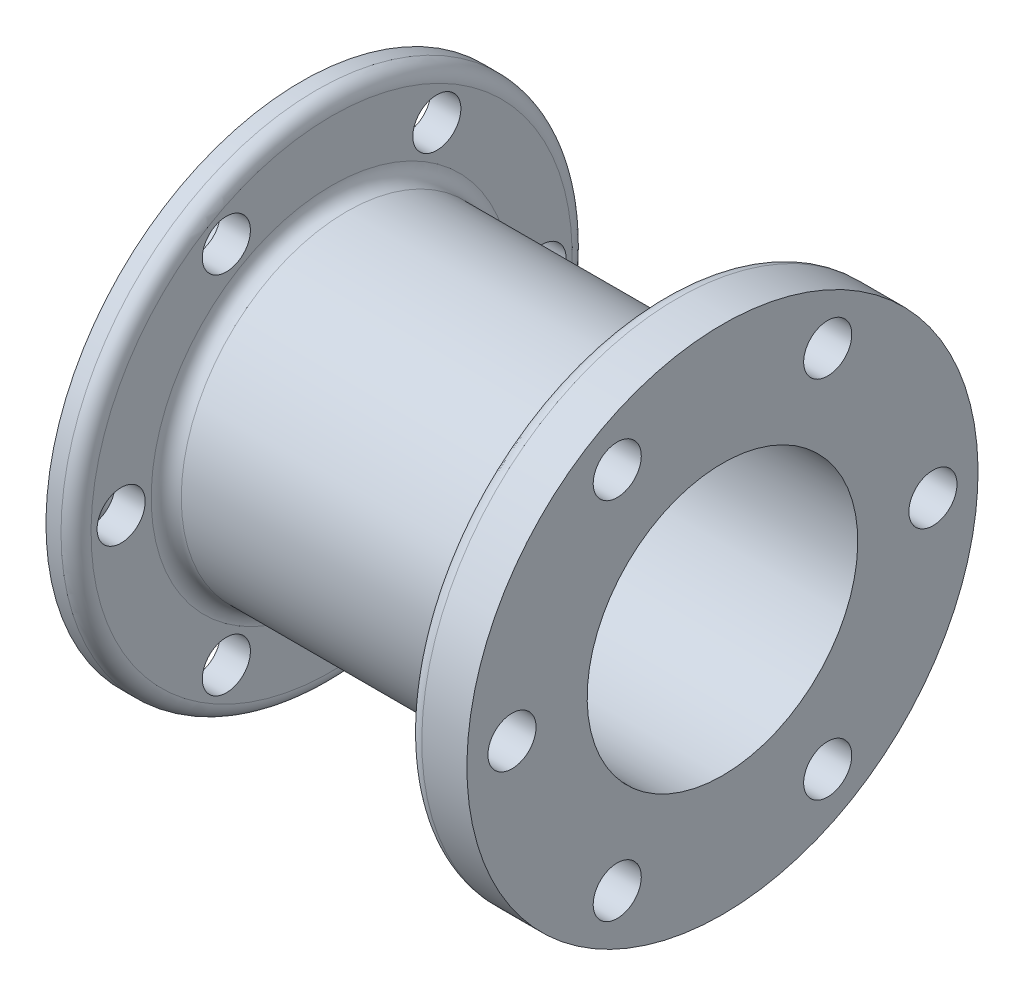
ISO-10303-21;
HEADER;
FILE_DESCRIPTION(('STEP AP214'),'2;1');
FILE_NAME('part.step','',(''),(''),'','','');
FILE_SCHEMA(('AUTOMOTIVE_DESIGN { 1 0 10303 214 1 1 1 1 }'));
ENDSEC;
DATA;
#1=APPLICATION_CONTEXT('core data for automotive mechanical design processes');
#2=APPLICATION_PROTOCOL_DEFINITION('international standard','automotive_design',2000,#1);
#3=PRODUCT_CONTEXT('',#1,'mechanical');
#4=PRODUCT('Part','Part','',(#3));
#5=PRODUCT_RELATED_PRODUCT_CATEGORY('part','',(#4));
#6=PRODUCT_DEFINITION_FORMATION('','',#4);
#7=PRODUCT_DEFINITION_CONTEXT('part definition',#1,'design');
#8=PRODUCT_DEFINITION('design','',#6,#7);
#9=PRODUCT_DEFINITION_SHAPE('','',#8);
#10=(LENGTH_UNIT() NAMED_UNIT(*) SI_UNIT(.MILLI.,.METRE.));
#11=(NAMED_UNIT(*) PLANE_ANGLE_UNIT() SI_UNIT($,.RADIAN.));
#12=(NAMED_UNIT(*) SI_UNIT($,.STERADIAN.) SOLID_ANGLE_UNIT());
#13=UNCERTAINTY_MEASURE_WITH_UNIT(LENGTH_MEASURE(1.E-05),#10,'distance_accuracy_value','');
#14=(GEOMETRIC_REPRESENTATION_CONTEXT(3) GLOBAL_UNCERTAINTY_ASSIGNED_CONTEXT((#13)) GLOBAL_UNIT_ASSIGNED_CONTEXT((#10,
#11,#12)) REPRESENTATION_CONTEXT('',''));
#15=CARTESIAN_POINT('',(0.,0.,0.));
#16=DIRECTION('',(0.,0.,1.));
#17=DIRECTION('',(1.,0.,0.));
#18=AXIS2_PLACEMENT_3D('',#15,#16,#17);
#19=CARTESIAN_POINT('',(-80.,0.,0.));
#20=DIRECTION('',(-1.,0.,0.));
#21=DIRECTION('',(0.,-1.,0.));
#22=AXIS2_PLACEMENT_3D('',#19,#20,#21);
#23=CYLINDRICAL_SURFACE('',#22,39.);
#24=CARTESIAN_POINT('',(-75.,0.,0.));
#25=DIRECTION('',(-1.,0.,0.));
#26=DIRECTION('',(0.,-1.,0.));
#27=AXIS2_PLACEMENT_3D('',#24,#25,#26);
#28=CIRCLE('',#27,39.);
#29=CARTESIAN_POINT('',(-75.,-39.,0.));
#30=VERTEX_POINT('',#29);
#31=EDGE_CURVE('E118',#30,#30,#28,.T.);
#32=ORIENTED_EDGE('',*,*,#31,.F.);
#33=EDGE_LOOP('',(#32));
#34=FACE_BOUND('',#33,.T.);
#35=CARTESIAN_POINT('',(-80.,0.,0.));
#36=DIRECTION('',(-1.,0.,0.));
#37=DIRECTION('',(0.,-1.,0.));
#38=AXIS2_PLACEMENT_3D('',#35,#36,#37);
#39=CIRCLE('',#38,39.);
#40=CARTESIAN_POINT('',(-80.,-39.,0.));
#41=VERTEX_POINT('',#40);
#42=EDGE_CURVE('E97',#41,#41,#39,.T.);
#43=ORIENTED_EDGE('',*,*,#42,.T.);
#44=EDGE_LOOP('',(#43));
#45=FACE_BOUND('',#44,.T.);
#46=ADVANCED_FACE('F36',(#34,#45),#23,.F.);
#47=CARTESIAN_POINT('',(-75.,1.73472347597681E-13,0.));
#48=DIRECTION('',(-1.,0.,0.));
#49=DIRECTION('',(0.,-1.,0.));
#50=AXIS2_PLACEMENT_3D('',#47,#48,#49);
#51=PLANE('',#50);
#52=CARTESIAN_POINT('',(-75.,0.,0.));
#53=DIRECTION('',(-1.,0.,0.));
#54=DIRECTION('',(0.,-1.,0.));
#55=AXIS2_PLACEMENT_3D('',#52,#53,#54);
#56=CIRCLE('',#55,45.);
#57=CARTESIAN_POINT('',(-75.,-45.,0.));
#58=VERTEX_POINT('',#57);
#59=EDGE_CURVE('E115',#58,#58,#56,.T.);
#60=ORIENTED_EDGE('',*,*,#59,.F.);
#61=EDGE_LOOP('',(#60));
#62=FACE_BOUND('',#61,.T.);
#63=ORIENTED_EDGE('',*,*,#31,.T.);
#64=EDGE_LOOP('',(#63));
#65=FACE_BOUND('',#64,.T.);
#66=ADVANCED_FACE('F180',(#62,#65),#51,.F.);
#67=CARTESIAN_POINT('',(-80.,0.,0.));
#68=DIRECTION('',(-1.,0.,0.));
#69=DIRECTION('',(0.,-1.,0.));
#70=AXIS2_PLACEMENT_3D('',#67,#68,#69);
#71=CYLINDRICAL_SURFACE('',#70,45.);
#72=CARTESIAN_POINT('',(80.,0.,0.));
#73=DIRECTION('',(-1.,0.,0.));
#74=DIRECTION('',(0.,-1.,0.));
#75=AXIS2_PLACEMENT_3D('',#72,#73,#74);
#76=CIRCLE('',#75,45.);
#77=CARTESIAN_POINT('',(80.,-45.,0.));
#78=VERTEX_POINT('',#77);
#79=EDGE_CURVE('E112',#78,#78,#76,.T.);
#80=ORIENTED_EDGE('',*,*,#79,.F.);
#81=EDGE_LOOP('',(#80));
#82=FACE_BOUND('',#81,.T.);
#83=ORIENTED_EDGE('',*,*,#59,.T.);
#84=EDGE_LOOP('',(#83));
#85=FACE_BOUND('',#84,.T.);
#86=ADVANCED_FACE('F186',(#82,#85),#71,.F.);
#87=CARTESIAN_POINT('',(80.,0.,0.));
#88=DIRECTION('',(-1.,0.,0.));
#89=DIRECTION('',(0.,-1.,0.));
#90=AXIS2_PLACEMENT_3D('',#87,#88,#89);
#91=PLANE('',#90);
#92=CARTESIAN_POINT('',(80.,0.,-70.));
#93=DIRECTION('',(1.,0.,0.));
#94=DIRECTION('',(0.,1.,0.));
#95=AXIS2_PLACEMENT_3D('',#92,#93,#94);
#96=CIRCLE('',#95,8.);
#97=CARTESIAN_POINT('',(80.,8.00000000000001,-70.));
#98=VERTEX_POINT('',#97);
#99=EDGE_CURVE('E57',#98,#98,#96,.T.);
#100=ORIENTED_EDGE('',*,*,#99,.F.);
#101=EDGE_LOOP('',(#100));
#102=FACE_BOUND('',#101,.T.);
#103=CARTESIAN_POINT('',(80.,60.6217782649108,-35.));
#104=DIRECTION('',(1.,0.,0.));
#105=DIRECTION('',(0.,1.,0.));
#106=AXIS2_PLACEMENT_3D('',#103,#104,#105);
#107=CIRCLE('',#106,7.99999999999998);
#108=CARTESIAN_POINT('',(80.,68.6217782649107,-35.));
#109=VERTEX_POINT('',#108);
#110=EDGE_CURVE('E462',#109,#109,#107,.T.);
#111=ORIENTED_EDGE('',*,*,#110,.F.);
#112=EDGE_LOOP('',(#111));
#113=FACE_BOUND('',#112,.T.);
#114=CARTESIAN_POINT('',(80.,60.6217782649107,35.));
#115=DIRECTION('',(1.,0.,0.));
#116=DIRECTION('',(0.,1.,0.));
#117=AXIS2_PLACEMENT_3D('',#114,#115,#116);
#118=CIRCLE('',#117,7.99999999999999);
#119=CARTESIAN_POINT('',(80.,68.6217782649107,35.));
#120=VERTEX_POINT('',#119);
#121=EDGE_CURVE('E464',#120,#120,#118,.T.);
#122=ORIENTED_EDGE('',*,*,#121,.F.);
#123=EDGE_LOOP('',(#122));
#124=FACE_BOUND('',#123,.T.);
#125=CARTESIAN_POINT('',(80.,0.,70.));
#126=DIRECTION('',(1.,0.,0.));
#127=DIRECTION('',(0.,1.,0.));
#128=AXIS2_PLACEMENT_3D('',#125,#126,#127);
#129=CIRCLE('',#128,7.99999999999999);
#130=CARTESIAN_POINT('',(80.,7.99999999999999,70.));
#131=VERTEX_POINT('',#130);
#132=EDGE_CURVE('E468',#131,#131,#129,.T.);
#133=ORIENTED_EDGE('',*,*,#132,.F.);
#134=EDGE_LOOP('',(#133));
#135=FACE_BOUND('',#134,.T.);
#136=CARTESIAN_POINT('',(80.0000000000001,-60.6217782649107,35.));
#137=DIRECTION('',(1.,0.,0.));
#138=DIRECTION('',(0.,1.,0.));
#139=AXIS2_PLACEMENT_3D('',#136,#137,#138);
#140=CIRCLE('',#139,8.);
#141=CARTESIAN_POINT('',(80.0000000000001,-52.6217782649107,35.));
#142=VERTEX_POINT('',#141);
#143=EDGE_CURVE('E459',#142,#142,#140,.T.);
#144=ORIENTED_EDGE('',*,*,#143,.F.);
#145=EDGE_LOOP('',(#144));
#146=FACE_BOUND('',#145,.T.);
#147=CARTESIAN_POINT('',(80.0000000000001,-60.6217782649107,-35.));
#148=DIRECTION('',(1.,0.,0.));
#149=DIRECTION('',(0.,1.,0.));
#150=AXIS2_PLACEMENT_3D('',#147,#148,#149);
#151=CIRCLE('',#150,8.00000000000001);
#152=CARTESIAN_POINT('',(80.0000000000001,-52.6217782649107,-35.));
#153=VERTEX_POINT('',#152);
#154=EDGE_CURVE('E456',#153,#153,#151,.T.);
#155=ORIENTED_EDGE('',*,*,#154,.F.);
#156=EDGE_LOOP('',(#155));
#157=FACE_BOUND('',#156,.T.);
#158=CARTESIAN_POINT('',(80.,0.,0.));
#159=DIRECTION('',(-1.,0.,0.));
#160=DIRECTION('',(0.,-1.,0.));
#161=AXIS2_PLACEMENT_3D('',#158,#159,#160);
#162=CIRCLE('',#161,85.);
#163=CARTESIAN_POINT('',(80.,-85.,0.));
#164=VERTEX_POINT('',#163);
#165=EDGE_CURVE('E109',#164,#164,#162,.T.);
#166=ORIENTED_EDGE('',*,*,#165,.F.);
#167=EDGE_LOOP('',(#166));
#168=FACE_BOUND('',#167,.T.);
#169=ORIENTED_EDGE('',*,*,#79,.T.);
#170=EDGE_LOOP('',(#169));
#171=FACE_BOUND('',#170,.T.);
#172=ADVANCED_FACE('F215',(#102,#113,#124,#135,#146,#157,#168,#171),#91,.F.);
#173=CARTESIAN_POINT('',(-80.,0.,0.));
#174=DIRECTION('',(-1.,0.,0.));
#175=DIRECTION('',(0.,-1.,0.));
#176=AXIS2_PLACEMENT_3D('',#173,#174,#175);
#177=CYLINDRICAL_SURFACE('',#176,85.);
#178=CARTESIAN_POINT('',(65.,0.,0.));
#179=DIRECTION('',(-1.,0.,0.));
#180=DIRECTION('',(0.,-1.,0.));
#181=AXIS2_PLACEMENT_3D('',#178,#179,#180);
#182=CIRCLE('',#181,85.);
#183=CARTESIAN_POINT('',(65.,-85.,0.));
#184=VERTEX_POINT('',#183);
#185=EDGE_CURVE('E127',#184,#184,#182,.F.);
#186=ORIENTED_EDGE('',*,*,#185,.T.);
#187=EDGE_LOOP('',(#186));
#188=FACE_BOUND('',#187,.T.);
#189=ORIENTED_EDGE('',*,*,#165,.T.);
#190=EDGE_LOOP('',(#189));
#191=FACE_BOUND('',#190,.T.);
#192=ADVANCED_FACE('F205',(#188,#191),#177,.T.);
#193=CARTESIAN_POINT('',(60.,0.,0.));
#194=DIRECTION('',(-1.,0.,0.));
#195=DIRECTION('',(0.,-1.,0.));
#196=AXIS2_PLACEMENT_3D('',#193,#194,#195);
#197=PLANE('',#196);
#198=CARTESIAN_POINT('',(60.,0.,-70.));
#199=DIRECTION('',(-1.,0.,0.));
#200=DIRECTION('',(0.,-1.,0.));
#201=AXIS2_PLACEMENT_3D('',#198,#199,#200);
#202=CIRCLE('',#201,8.);
#203=CARTESIAN_POINT('',(60.,-7.99999999999999,-70.));
#204=VERTEX_POINT('',#203);
#205=EDGE_CURVE('E94',#204,#204,#202,.T.);
#206=ORIENTED_EDGE('',*,*,#205,.F.);
#207=EDGE_LOOP('',(#206));
#208=FACE_BOUND('',#207,.T.);
#209=CARTESIAN_POINT('',(60.,60.6217782649108,-35.));
#210=DIRECTION('',(-1.,0.,0.));
#211=DIRECTION('',(0.,-1.,0.));
#212=AXIS2_PLACEMENT_3D('',#209,#210,#211);
#213=CIRCLE('',#212,7.99999999999998);
#214=CARTESIAN_POINT('',(60.,52.6217782649108,-35.));
#215=VERTEX_POINT('',#214);
#216=EDGE_CURVE('E79',#215,#215,#213,.T.);
#217=ORIENTED_EDGE('',*,*,#216,.F.);
#218=EDGE_LOOP('',(#217));
#219=FACE_BOUND('',#218,.T.);
#220=CARTESIAN_POINT('',(60.,60.6217782649107,35.));
#221=DIRECTION('',(-1.,0.,0.));
#222=DIRECTION('',(0.,-1.,0.));
#223=AXIS2_PLACEMENT_3D('',#220,#221,#222);
#224=CIRCLE('',#223,7.99999999999999);
#225=CARTESIAN_POINT('',(60.,52.6217782649107,35.));
#226=VERTEX_POINT('',#225);
#227=EDGE_CURVE('E75',#226,#226,#224,.T.);
#228=ORIENTED_EDGE('',*,*,#227,.F.);
#229=EDGE_LOOP('',(#228));
#230=FACE_BOUND('',#229,.T.);
#231=CARTESIAN_POINT('',(60.,0.,70.));
#232=DIRECTION('',(-1.,0.,0.));
#233=DIRECTION('',(0.,-1.,0.));
#234=AXIS2_PLACEMENT_3D('',#231,#232,#233);
#235=CIRCLE('',#234,7.99999999999999);
#236=CARTESIAN_POINT('',(60.,-7.99999999999999,70.));
#237=VERTEX_POINT('',#236);
#238=EDGE_CURVE('E71',#237,#237,#235,.T.);
#239=ORIENTED_EDGE('',*,*,#238,.F.);
#240=EDGE_LOOP('',(#239));
#241=FACE_BOUND('',#240,.T.);
#242=CARTESIAN_POINT('',(60.,-60.6217782649107,35.));
#243=DIRECTION('',(-1.,0.,0.));
#244=DIRECTION('',(0.,-1.,0.));
#245=AXIS2_PLACEMENT_3D('',#242,#243,#244);
#246=CIRCLE('',#245,8.);
#247=CARTESIAN_POINT('',(60.,-68.6217782649107,35.));
#248=VERTEX_POINT('',#247);
#249=EDGE_CURVE('E67',#248,#248,#246,.T.);
#250=ORIENTED_EDGE('',*,*,#249,.F.);
#251=EDGE_LOOP('',(#250));
#252=FACE_BOUND('',#251,.T.);
#253=CARTESIAN_POINT('',(60.,-60.6217782649107,-35.));
#254=DIRECTION('',(-1.,0.,0.));
#255=DIRECTION('',(0.,-1.,0.));
#256=AXIS2_PLACEMENT_3D('',#253,#254,#255);
#257=CIRCLE('',#256,8.00000000000001);
#258=CARTESIAN_POINT('',(60.,-68.6217782649107,-35.));
#259=VERTEX_POINT('',#258);
#260=EDGE_CURVE('E62',#259,#259,#257,.T.);
#261=ORIENTED_EDGE('',*,*,#260,.F.);
#262=EDGE_LOOP('',(#261));
#263=FACE_BOUND('',#262,.T.);
#264=CARTESIAN_POINT('',(60.,0.,0.));
#265=DIRECTION('',(-1.,0.,0.));
#266=DIRECTION('',(0.,-1.,0.));
#267=AXIS2_PLACEMENT_3D('',#264,#265,#266);
#268=CIRCLE('',#267,80.);
#269=CARTESIAN_POINT('',(60.,-79.9999999999999,0.));
#270=VERTEX_POINT('',#269);
#271=EDGE_CURVE('E124',#270,#270,#268,.T.);
#272=ORIENTED_EDGE('',*,*,#271,.T.);
#273=EDGE_LOOP('',(#272));
#274=FACE_BOUND('',#273,.T.);
#275=CARTESIAN_POINT('',(60.,0.,0.));
#276=DIRECTION('',(-1.,0.,0.));
#277=DIRECTION('',(0.,-1.,0.));
#278=AXIS2_PLACEMENT_3D('',#275,#276,#277);
#279=CIRCLE('',#278,60.);
#280=CARTESIAN_POINT('',(60.,-60.,0.));
#281=VERTEX_POINT('',#280);
#282=EDGE_CURVE('E121',#281,#281,#279,.F.);
#283=ORIENTED_EDGE('',*,*,#282,.T.);
#284=EDGE_LOOP('',(#283));
#285=FACE_BOUND('',#284,.T.);
#286=ADVANCED_FACE('F202',(#208,#219,#230,#241,#252,#263,#274,#285),#197,.T.);
#287=CARTESIAN_POINT('',(-80.,0.,0.));
#288=DIRECTION('',(-1.,0.,0.));
#289=DIRECTION('',(0.,-1.,0.));
#290=AXIS2_PLACEMENT_3D('',#287,#288,#289);
#291=CYLINDRICAL_SURFACE('',#290,55.);
#292=CARTESIAN_POINT('',(55.,0.,0.));
#293=DIRECTION('',(-1.,0.,0.));
#294=DIRECTION('',(0.,-1.,0.));
#295=AXIS2_PLACEMENT_3D('',#292,#293,#294);
#296=CIRCLE('',#295,55.);
#297=CARTESIAN_POINT('',(55.,-55.,0.));
#298=VERTEX_POINT('',#297);
#299=EDGE_CURVE('E10',#298,#298,#296,.T.);
#300=ORIENTED_EDGE('',*,*,#299,.T.);
#301=EDGE_LOOP('',(#300));
#302=FACE_BOUND('',#301,.T.);
#303=CARTESIAN_POINT('',(-45.,0.,0.));
#304=DIRECTION('',(1.,0.,0.));
#305=DIRECTION('',(0.,1.,0.));
#306=AXIS2_PLACEMENT_3D('',#303,#304,#305);
#307=CIRCLE('',#306,55.);
#308=CARTESIAN_POINT('',(-45.,55.,0.));
#309=VERTEX_POINT('',#308);
#310=EDGE_CURVE('E44',#309,#309,#307,.T.);
#311=ORIENTED_EDGE('',*,*,#310,.T.);
#312=EDGE_LOOP('',(#311));
#313=FACE_BOUND('',#312,.T.);
#314=ADVANCED_FACE('F204',(#302,#313),#291,.T.);
#315=CARTESIAN_POINT('',(-50.,0.,0.));
#316=DIRECTION('',(1.,0.,0.));
#317=DIRECTION('',(0.,1.,0.));
#318=AXIS2_PLACEMENT_3D('',#315,#316,#317);
#319=PLANE('',#318);
#320=CARTESIAN_POINT('',(-50.,0.,-70.));
#321=DIRECTION('',(1.,0.,0.));
#322=DIRECTION('',(0.,1.,0.));
#323=AXIS2_PLACEMENT_3D('',#320,#321,#322);
#324=CIRCLE('',#323,8.);
#325=CARTESIAN_POINT('',(-50.,7.99999999999999,-70.));
#326=VERTEX_POINT('',#325);
#327=EDGE_CURVE('E91',#326,#326,#324,.T.);
#328=ORIENTED_EDGE('',*,*,#327,.F.);
#329=EDGE_LOOP('',(#328));
#330=FACE_BOUND('',#329,.T.);
#331=CARTESIAN_POINT('',(-50.,60.6217782649107,-35.));
#332=DIRECTION('',(1.,0.,0.));
#333=DIRECTION('',(0.,1.,0.));
#334=AXIS2_PLACEMENT_3D('',#331,#332,#333);
#335=CIRCLE('',#334,7.99999999999998);
#336=CARTESIAN_POINT('',(-50.,68.6217782649107,-35.));
#337=VERTEX_POINT('',#336);
#338=EDGE_CURVE('E74',#337,#337,#335,.T.);
#339=ORIENTED_EDGE('',*,*,#338,.F.);
#340=EDGE_LOOP('',(#339));
#341=FACE_BOUND('',#340,.T.);
#342=CARTESIAN_POINT('',(-50.,60.6217782649107,35.));
#343=DIRECTION('',(1.,0.,0.));
#344=DIRECTION('',(0.,1.,0.));
#345=AXIS2_PLACEMENT_3D('',#342,#343,#344);
#346=CIRCLE('',#345,7.99999999999999);
#347=CARTESIAN_POINT('',(-50.,68.6217782649107,35.));
#348=VERTEX_POINT('',#347);
#349=EDGE_CURVE('E70',#348,#348,#346,.T.);
#350=ORIENTED_EDGE('',*,*,#349,.F.);
#351=EDGE_LOOP('',(#350));
#352=FACE_BOUND('',#351,.T.);
#353=CARTESIAN_POINT('',(-50.,0.,70.));
#354=DIRECTION('',(1.,0.,0.));
#355=DIRECTION('',(0.,1.,0.));
#356=AXIS2_PLACEMENT_3D('',#353,#354,#355);
#357=CIRCLE('',#356,7.99999999999999);
#358=CARTESIAN_POINT('',(-50.,7.99999999999997,70.));
#359=VERTEX_POINT('',#358);
#360=EDGE_CURVE('E66',#359,#359,#357,.T.);
#361=ORIENTED_EDGE('',*,*,#360,.F.);
#362=EDGE_LOOP('',(#361));
#363=FACE_BOUND('',#362,.T.);
#364=CARTESIAN_POINT('',(-50.,-60.6217782649107,35.));
#365=DIRECTION('',(1.,0.,0.));
#366=DIRECTION('',(0.,1.,0.));
#367=AXIS2_PLACEMENT_3D('',#364,#365,#366);
#368=CIRCLE('',#367,8.);
#369=CARTESIAN_POINT('',(-50.,-52.6217782649107,35.));
#370=VERTEX_POINT('',#369);
#371=EDGE_CURVE('E61',#370,#370,#368,.T.);
#372=ORIENTED_EDGE('',*,*,#371,.F.);
#373=EDGE_LOOP('',(#372));
#374=FACE_BOUND('',#373,.T.);
#375=CARTESIAN_POINT('',(-50.,-60.6217782649107,-35.));
#376=DIRECTION('',(1.,0.,0.));
#377=DIRECTION('',(0.,1.,0.));
#378=AXIS2_PLACEMENT_3D('',#375,#376,#377);
#379=CIRCLE('',#378,8.00000000000001);
#380=CARTESIAN_POINT('',(-50.,-52.6217782649107,-35.));
#381=VERTEX_POINT('',#380);
#382=EDGE_CURVE('E56',#381,#381,#379,.T.);
#383=ORIENTED_EDGE('',*,*,#382,.F.);
#384=EDGE_LOOP('',(#383));
#385=FACE_BOUND('',#384,.T.);
#386=CARTESIAN_POINT('',(-50.,0.,0.));
#387=DIRECTION('',(1.,0.,0.));
#388=DIRECTION('',(0.,1.,0.));
#389=AXIS2_PLACEMENT_3D('',#386,#387,#388);
#390=CIRCLE('',#389,80.);
#391=CARTESIAN_POINT('',(-50.,80.,0.));
#392=VERTEX_POINT('',#391);
#393=EDGE_CURVE('E49',#392,#392,#390,.T.);
#394=ORIENTED_EDGE('',*,*,#393,.T.);
#395=EDGE_LOOP('',(#394));
#396=FACE_BOUND('',#395,.T.);
#397=CARTESIAN_POINT('',(-50.,0.,0.));
#398=DIRECTION('',(1.,0.,0.));
#399=DIRECTION('',(0.,1.,0.));
#400=AXIS2_PLACEMENT_3D('',#397,#398,#399);
#401=CIRCLE('',#400,60.);
#402=CARTESIAN_POINT('',(-50.,60.,0.));
#403=VERTEX_POINT('',#402);
#404=EDGE_CURVE('E133',#403,#403,#401,.F.);
#405=ORIENTED_EDGE('',*,*,#404,.T.);
#406=EDGE_LOOP('',(#405));
#407=FACE_BOUND('',#406,.T.);
#408=ADVANCED_FACE('F138',(#330,#341,#352,#363,#374,#385,#396,#407),#319,.T.);
#409=CARTESIAN_POINT('',(-80.,0.,0.));
#410=DIRECTION('',(-1.,0.,0.));
#411=DIRECTION('',(0.,-1.,0.));
#412=AXIS2_PLACEMENT_3D('',#409,#410,#411);
#413=CYLINDRICAL_SURFACE('',#412,85.);
#414=CARTESIAN_POINT('',(-55.,0.,0.));
#415=DIRECTION('',(1.,0.,0.));
#416=DIRECTION('',(0.,1.,0.));
#417=AXIS2_PLACEMENT_3D('',#414,#415,#416);
#418=CIRCLE('',#417,85.);
#419=CARTESIAN_POINT('',(-55.,85.,0.));
#420=VERTEX_POINT('',#419);
#421=EDGE_CURVE('E130',#420,#420,#418,.F.);
#422=ORIENTED_EDGE('',*,*,#421,.T.);
#423=EDGE_LOOP('',(#422));
#424=FACE_BOUND('',#423,.T.);
#425=CARTESIAN_POINT('',(-60.,0.,0.));
#426=DIRECTION('',(-1.,0.,0.));
#427=DIRECTION('',(0.,-1.,0.));
#428=AXIS2_PLACEMENT_3D('',#425,#426,#427);
#429=CIRCLE('',#428,85.);
#430=CARTESIAN_POINT('',(-60.,-85.,0.));
#431=VERTEX_POINT('',#430);
#432=EDGE_CURVE('E106',#431,#431,#429,.T.);
#433=ORIENTED_EDGE('',*,*,#432,.F.);
#434=EDGE_LOOP('',(#433));
#435=FACE_BOUND('',#434,.T.);
#436=ADVANCED_FACE('F149',(#424,#435),#413,.T.);
#437=CARTESIAN_POINT('',(-60.,0.,0.));
#438=DIRECTION('',(-1.,0.,0.));
#439=DIRECTION('',(0.,-1.,0.));
#440=AXIS2_PLACEMENT_3D('',#437,#438,#439);
#441=PLANE('',#440);
#442=CARTESIAN_POINT('',(-60.,0.,-70.));
#443=DIRECTION('',(-1.,0.,0.));
#444=DIRECTION('',(0.,-1.,0.));
#445=AXIS2_PLACEMENT_3D('',#442,#443,#444);
#446=CIRCLE('',#445,8.);
#447=CARTESIAN_POINT('',(-60.,-8.00000000000001,-70.));
#448=VERTEX_POINT('',#447);
#449=EDGE_CURVE('E40',#448,#448,#446,.T.);
#450=ORIENTED_EDGE('',*,*,#449,.F.);
#451=EDGE_LOOP('',(#450));
#452=FACE_BOUND('',#451,.T.);
#453=CARTESIAN_POINT('',(-60.,60.6217782649107,-35.));
#454=DIRECTION('',(-1.,0.,0.));
#455=DIRECTION('',(0.,-1.,0.));
#456=AXIS2_PLACEMENT_3D('',#453,#454,#455);
#457=CIRCLE('',#456,7.99999999999998);
#458=CARTESIAN_POINT('',(-60.,52.6217782649108,-35.));
#459=VERTEX_POINT('',#458);
#460=EDGE_CURVE('E72',#459,#459,#457,.T.);
#461=ORIENTED_EDGE('',*,*,#460,.F.);
#462=EDGE_LOOP('',(#461));
#463=FACE_BOUND('',#462,.T.);
#464=CARTESIAN_POINT('',(-60.,60.6217782649107,35.));
#465=DIRECTION('',(-1.,0.,0.));
#466=DIRECTION('',(0.,-1.,0.));
#467=AXIS2_PLACEMENT_3D('',#464,#465,#466);
#468=CIRCLE('',#467,7.99999999999999);
#469=CARTESIAN_POINT('',(-60.,52.6217782649107,35.));
#470=VERTEX_POINT('',#469);
#471=EDGE_CURVE('E68',#470,#470,#468,.T.);
#472=ORIENTED_EDGE('',*,*,#471,.F.);
#473=EDGE_LOOP('',(#472));
#474=FACE_BOUND('',#473,.T.);
#475=CARTESIAN_POINT('',(-60.,0.,70.));
#476=DIRECTION('',(-1.,0.,0.));
#477=DIRECTION('',(0.,-1.,0.));
#478=AXIS2_PLACEMENT_3D('',#475,#476,#477);
#479=CIRCLE('',#478,7.99999999999999);
#480=CARTESIAN_POINT('',(-60.,-8.00000000000001,70.));
#481=VERTEX_POINT('',#480);
#482=EDGE_CURVE('E63',#481,#481,#479,.T.);
#483=ORIENTED_EDGE('',*,*,#482,.F.);
#484=EDGE_LOOP('',(#483));
#485=FACE_BOUND('',#484,.T.);
#486=CARTESIAN_POINT('',(-60.,-60.6217782649107,35.));
#487=DIRECTION('',(-1.,0.,0.));
#488=DIRECTION('',(0.,-1.,0.));
#489=AXIS2_PLACEMENT_3D('',#486,#487,#488);
#490=CIRCLE('',#489,8.);
#491=CARTESIAN_POINT('',(-60.,-68.6217782649107,35.));
#492=VERTEX_POINT('',#491);
#493=EDGE_CURVE('E58',#492,#492,#490,.T.);
#494=ORIENTED_EDGE('',*,*,#493,.F.);
#495=EDGE_LOOP('',(#494));
#496=FACE_BOUND('',#495,.T.);
#497=CARTESIAN_POINT('',(-60.,-60.6217782649107,-35.));
#498=DIRECTION('',(-1.,0.,0.));
#499=DIRECTION('',(0.,-1.,0.));
#500=AXIS2_PLACEMENT_3D('',#497,#498,#499);
#501=CIRCLE('',#500,8.00000000000001);
#502=CARTESIAN_POINT('',(-60.,-68.6217782649107,-35.));
#503=VERTEX_POINT('',#502);
#504=EDGE_CURVE('E53',#503,#503,#501,.T.);
#505=ORIENTED_EDGE('',*,*,#504,.F.);
#506=EDGE_LOOP('',(#505));
#507=FACE_BOUND('',#506,.T.);
#508=ORIENTED_EDGE('',*,*,#432,.T.);
#509=EDGE_LOOP('',(#508));
#510=FACE_BOUND('',#509,.T.);
#511=CARTESIAN_POINT('',(-60.,0.,0.));
#512=DIRECTION('',(-1.,0.,0.));
#513=DIRECTION('',(0.,-1.,0.));
#514=AXIS2_PLACEMENT_3D('',#511,#512,#513);
#515=CIRCLE('',#514,55.);
#516=CARTESIAN_POINT('',(-60.,-55.,0.));
#517=VERTEX_POINT('',#516);
#518=EDGE_CURVE('E103',#517,#517,#515,.T.);
#519=ORIENTED_EDGE('',*,*,#518,.F.);
#520=EDGE_LOOP('',(#519));
#521=FACE_BOUND('',#520,.T.);
#522=ADVANCED_FACE('F152',(#452,#463,#474,#485,#496,#507,#510,#521),#441,.T.);
#523=CARTESIAN_POINT('',(-80.,0.,0.));
#524=DIRECTION('',(-1.,0.,0.));
#525=DIRECTION('',(0.,-1.,0.));
#526=AXIS2_PLACEMENT_3D('',#523,#524,#525);
#527=CYLINDRICAL_SURFACE('',#526,55.);
#528=ORIENTED_EDGE('',*,*,#518,.T.);
#529=EDGE_LOOP('',(#528));
#530=FACE_BOUND('',#529,.T.);
#531=CARTESIAN_POINT('',(-80.,0.,0.));
#532=DIRECTION('',(-1.,0.,0.));
#533=DIRECTION('',(0.,-1.,0.));
#534=AXIS2_PLACEMENT_3D('',#531,#532,#533);
#535=CIRCLE('',#534,55.);
#536=CARTESIAN_POINT('',(-80.,-55.,0.));
#537=VERTEX_POINT('',#536);
#538=EDGE_CURVE('E100',#537,#537,#535,.T.);
#539=ORIENTED_EDGE('',*,*,#538,.F.);
#540=EDGE_LOOP('',(#539));
#541=FACE_BOUND('',#540,.T.);
#542=ADVANCED_FACE('F158',(#530,#541),#527,.T.);
#543=CARTESIAN_POINT('',(-80.,0.,0.));
#544=DIRECTION('',(1.,0.,0.));
#545=DIRECTION('',(0.,1.,0.));
#546=AXIS2_PLACEMENT_3D('',#543,#544,#545);
#547=PLANE('',#546);
#548=ORIENTED_EDGE('',*,*,#42,.F.);
#549=EDGE_LOOP('',(#548));
#550=FACE_BOUND('',#549,.T.);
#551=ORIENTED_EDGE('',*,*,#538,.T.);
#552=EDGE_LOOP('',(#551));
#553=FACE_BOUND('',#552,.T.);
#554=ADVANCED_FACE('F165',(#550,#553),#547,.F.);
#555=CARTESIAN_POINT('',(65.,0.,0.));
#556=DIRECTION('',(-1.,0.,0.));
#557=DIRECTION('',(0.,-1.,0.));
#558=AXIS2_PLACEMENT_3D('',#555,#556,#557);
#559=TOROIDAL_SURFACE('',#558,80.,5.);
#560=ORIENTED_EDGE('',*,*,#185,.F.);
#561=EDGE_LOOP('',(#560));
#562=FACE_BOUND('',#561,.T.);
#563=ORIENTED_EDGE('',*,*,#271,.F.);
#564=EDGE_LOOP('',(#563));
#565=FACE_BOUND('',#564,.T.);
#566=ADVANCED_FACE('F145',(#562,#565),#559,.T.);
#567=CARTESIAN_POINT('',(-55.,0.,0.));
#568=DIRECTION('',(1.,0.,0.));
#569=DIRECTION('',(0.,1.,0.));
#570=AXIS2_PLACEMENT_3D('',#567,#568,#569);
#571=TOROIDAL_SURFACE('',#570,80.,5.);
#572=ORIENTED_EDGE('',*,*,#393,.F.);
#573=EDGE_LOOP('',(#572));
#574=FACE_BOUND('',#573,.T.);
#575=ORIENTED_EDGE('',*,*,#421,.F.);
#576=EDGE_LOOP('',(#575));
#577=FACE_BOUND('',#576,.T.);
#578=ADVANCED_FACE('F141',(#574,#577),#571,.T.);
#579=CARTESIAN_POINT('',(55.,0.,0.));
#580=DIRECTION('',(-1.,0.,0.));
#581=DIRECTION('',(0.,-1.,0.));
#582=AXIS2_PLACEMENT_3D('',#579,#580,#581);
#583=TOROIDAL_SURFACE('',#582,60.,5.);
#584=ORIENTED_EDGE('',*,*,#282,.F.);
#585=EDGE_LOOP('',(#584));
#586=FACE_BOUND('',#585,.T.);
#587=ORIENTED_EDGE('',*,*,#299,.F.);
#588=EDGE_LOOP('',(#587));
#589=FACE_BOUND('',#588,.T.);
#590=ADVANCED_FACE('F144',(#586,#589),#583,.F.);
#591=CARTESIAN_POINT('',(-45.,0.,0.));
#592=DIRECTION('',(1.,0.,0.));
#593=DIRECTION('',(0.,1.,0.));
#594=AXIS2_PLACEMENT_3D('',#591,#592,#593);
#595=TOROIDAL_SURFACE('',#594,60.,5.);
#596=ORIENTED_EDGE('',*,*,#310,.F.);
#597=EDGE_LOOP('',(#596));
#598=FACE_BOUND('',#597,.T.);
#599=ORIENTED_EDGE('',*,*,#404,.F.);
#600=EDGE_LOOP('',(#599));
#601=FACE_BOUND('',#600,.T.);
#602=ADVANCED_FACE('F38',(#598,#601),#595,.F.);
#603=CARTESIAN_POINT('',(-80.,-60.6217782649107,-35.));
#604=DIRECTION('',(1.,0.,0.));
#605=DIRECTION('',(0.,1.,0.));
#606=AXIS2_PLACEMENT_3D('',#603,#604,#605);
#607=CYLINDRICAL_SURFACE('',#606,8.00000000000001);
#608=ORIENTED_EDGE('',*,*,#382,.T.);
#609=EDGE_LOOP('',(#608));
#610=FACE_BOUND('',#609,.T.);
#611=ORIENTED_EDGE('',*,*,#504,.T.);
#612=EDGE_LOOP('',(#611));
#613=FACE_BOUND('',#612,.T.);
#614=ADVANCED_FACE('F197',(#610,#613),#607,.F.);
#615=CARTESIAN_POINT('',(-80.,-60.6217782649107,35.));
#616=DIRECTION('',(1.,0.,0.));
#617=DIRECTION('',(0.,1.,0.));
#618=AXIS2_PLACEMENT_3D('',#615,#616,#617);
#619=CYLINDRICAL_SURFACE('',#618,8.);
#620=ORIENTED_EDGE('',*,*,#371,.T.);
#621=EDGE_LOOP('',(#620));
#622=FACE_BOUND('',#621,.T.);
#623=ORIENTED_EDGE('',*,*,#493,.T.);
#624=EDGE_LOOP('',(#623));
#625=FACE_BOUND('',#624,.T.);
#626=ADVANCED_FACE('F324',(#622,#625),#619,.F.);
#627=CARTESIAN_POINT('',(-80.,0.,70.));
#628=DIRECTION('',(1.,0.,0.));
#629=DIRECTION('',(0.,1.,0.));
#630=AXIS2_PLACEMENT_3D('',#627,#628,#629);
#631=CYLINDRICAL_SURFACE('',#630,7.99999999999999);
#632=ORIENTED_EDGE('',*,*,#360,.T.);
#633=EDGE_LOOP('',(#632));
#634=FACE_BOUND('',#633,.T.);
#635=ORIENTED_EDGE('',*,*,#482,.T.);
#636=EDGE_LOOP('',(#635));
#637=FACE_BOUND('',#636,.T.);
#638=ADVANCED_FACE('F336',(#634,#637),#631,.F.);
#639=CARTESIAN_POINT('',(-80.,60.6217782649107,35.));
#640=DIRECTION('',(1.,0.,0.));
#641=DIRECTION('',(0.,1.,0.));
#642=AXIS2_PLACEMENT_3D('',#639,#640,#641);
#643=CYLINDRICAL_SURFACE('',#642,7.99999999999999);
#644=ORIENTED_EDGE('',*,*,#349,.T.);
#645=EDGE_LOOP('',(#644));
#646=FACE_BOUND('',#645,.T.);
#647=ORIENTED_EDGE('',*,*,#471,.T.);
#648=EDGE_LOOP('',(#647));
#649=FACE_BOUND('',#648,.T.);
#650=ADVANCED_FACE('F348',(#646,#649),#643,.F.);
#651=CARTESIAN_POINT('',(-80.,60.6217782649107,-35.));
#652=DIRECTION('',(1.,0.,0.));
#653=DIRECTION('',(0.,1.,0.));
#654=AXIS2_PLACEMENT_3D('',#651,#652,#653);
#655=CYLINDRICAL_SURFACE('',#654,7.99999999999998);
#656=ORIENTED_EDGE('',*,*,#338,.T.);
#657=EDGE_LOOP('',(#656));
#658=FACE_BOUND('',#657,.T.);
#659=ORIENTED_EDGE('',*,*,#460,.T.);
#660=EDGE_LOOP('',(#659));
#661=FACE_BOUND('',#660,.T.);
#662=ADVANCED_FACE('F360',(#658,#661),#655,.F.);
#663=CARTESIAN_POINT('',(-80.,0.,-70.));
#664=DIRECTION('',(1.,0.,0.));
#665=DIRECTION('',(0.,1.,0.));
#666=AXIS2_PLACEMENT_3D('',#663,#664,#665);
#667=CYLINDRICAL_SURFACE('',#666,8.);
#668=ORIENTED_EDGE('',*,*,#327,.T.);
#669=EDGE_LOOP('',(#668));
#670=FACE_BOUND('',#669,.T.);
#671=ORIENTED_EDGE('',*,*,#449,.T.);
#672=EDGE_LOOP('',(#671));
#673=FACE_BOUND('',#672,.T.);
#674=ADVANCED_FACE('F371',(#670,#673),#667,.F.);
#675=ORIENTED_EDGE('',*,*,#260,.T.);
#676=EDGE_LOOP('',(#675));
#677=FACE_BOUND('',#676,.T.);
#678=ORIENTED_EDGE('',*,*,#154,.T.);
#679=EDGE_LOOP('',(#678));
#680=FACE_BOUND('',#679,.T.);
#681=ADVANCED_FACE('F327',(#677,#680),#607,.F.);
#682=ORIENTED_EDGE('',*,*,#249,.T.);
#683=EDGE_LOOP('',(#682));
#684=FACE_BOUND('',#683,.T.);
#685=ORIENTED_EDGE('',*,*,#143,.T.);
#686=EDGE_LOOP('',(#685));
#687=FACE_BOUND('',#686,.T.);
#688=ADVANCED_FACE('F339',(#684,#687),#619,.F.);
#689=ORIENTED_EDGE('',*,*,#238,.T.);
#690=EDGE_LOOP('',(#689));
#691=FACE_BOUND('',#690,.T.);
#692=ORIENTED_EDGE('',*,*,#132,.T.);
#693=EDGE_LOOP('',(#692));
#694=FACE_BOUND('',#693,.T.);
#695=ADVANCED_FACE('F351',(#691,#694),#631,.F.);
#696=ORIENTED_EDGE('',*,*,#227,.T.);
#697=EDGE_LOOP('',(#696));
#698=FACE_BOUND('',#697,.T.);
#699=ORIENTED_EDGE('',*,*,#121,.T.);
#700=EDGE_LOOP('',(#699));
#701=FACE_BOUND('',#700,.T.);
#702=ADVANCED_FACE('F362',(#698,#701),#643,.F.);
#703=ORIENTED_EDGE('',*,*,#216,.T.);
#704=EDGE_LOOP('',(#703));
#705=FACE_BOUND('',#704,.T.);
#706=ORIENTED_EDGE('',*,*,#110,.T.);
#707=EDGE_LOOP('',(#706));
#708=FACE_BOUND('',#707,.T.);
#709=ADVANCED_FACE('F374',(#705,#708),#655,.F.);
#710=ORIENTED_EDGE('',*,*,#205,.T.);
#711=EDGE_LOOP('',(#710));
#712=FACE_BOUND('',#711,.T.);
#713=ORIENTED_EDGE('',*,*,#99,.T.);
#714=EDGE_LOOP('',(#713));
#715=FACE_BOUND('',#714,.T.);
#716=ADVANCED_FACE('F385',(#712,#715),#667,.F.);
#717=CLOSED_SHELL('',(#46,#66,#86,#172,#192,#286,#314,#408,#436,#522,#542,#554,#566,#578,#590,
#602,#614,#626,#638,#650,#662,#674,#681,#688,#695,#702,#709,#716));
#718=MANIFOLD_SOLID_BREP('B2',#717);
#719=ADVANCED_BREP_SHAPE_REPRESENTATION('',(#18,#718),#14);
#720=SHAPE_DEFINITION_REPRESENTATION(#9,#719);
ENDSEC;
END-ISO-10303-21;
